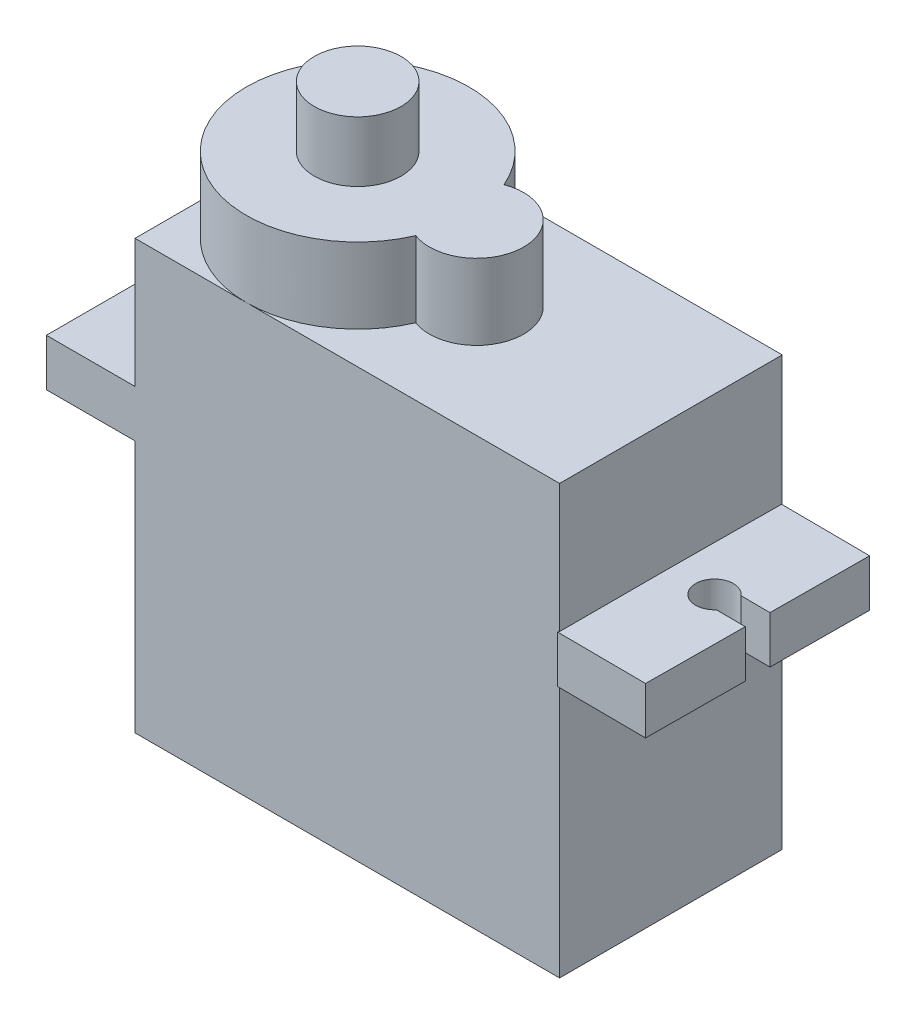
ISO-10303-21;
HEADER;
FILE_DESCRIPTION(('STEP AP214'),'2;1');
FILE_NAME('part.step','',(''),(''),'','','');
FILE_SCHEMA(('AUTOMOTIVE_DESIGN { 1 0 10303 214 1 1 1 1 }'));
ENDSEC;
DATA;
#1=APPLICATION_CONTEXT('core data for automotive mechanical design processes');
#2=APPLICATION_PROTOCOL_DEFINITION('international standard','automotive_design',2000,#1);
#3=PRODUCT_CONTEXT('',#1,'mechanical');
#4=PRODUCT('Part','Part','',(#3));
#5=PRODUCT_RELATED_PRODUCT_CATEGORY('part','',(#4));
#6=PRODUCT_DEFINITION_FORMATION('','',#4);
#7=PRODUCT_DEFINITION_CONTEXT('part definition',#1,'design');
#8=PRODUCT_DEFINITION('design','',#6,#7);
#9=PRODUCT_DEFINITION_SHAPE('','',#8);
#10=(LENGTH_UNIT() NAMED_UNIT(*) SI_UNIT(.MILLI.,.METRE.));
#11=(NAMED_UNIT(*) PLANE_ANGLE_UNIT() SI_UNIT($,.RADIAN.));
#12=(NAMED_UNIT(*) SI_UNIT($,.STERADIAN.) SOLID_ANGLE_UNIT());
#13=UNCERTAINTY_MEASURE_WITH_UNIT(LENGTH_MEASURE(1.E-05),#10,'distance_accuracy_value','');
#14=(GEOMETRIC_REPRESENTATION_CONTEXT(3) GLOBAL_UNCERTAINTY_ASSIGNED_CONTEXT((#13)) GLOBAL_UNIT_ASSIGNED_CONTEXT((#10,
#11,#12)) REPRESENTATION_CONTEXT('',''));
#15=CARTESIAN_POINT('',(0.,0.,0.));
#16=DIRECTION('',(0.,0.,1.));
#17=DIRECTION('',(1.,0.,0.));
#18=AXIS2_PLACEMENT_3D('',#15,#16,#17);
#19=CARTESIAN_POINT('',(-11.25,22.7,5.9));
#20=DIRECTION('',(1.,0.,0.));
#21=DIRECTION('',(0.,0.,-1.));
#22=AXIS2_PLACEMENT_3D('',#19,#20,#21);
#23=PLANE('',#22);
#24=DIRECTION('',(0.,0.,1.));
#25=VECTOR('',#24,1.);
#26=CARTESIAN_POINT('',(-11.25,13.4,-5.9));
#27=LINE('',#26,#25);
#28=CARTESIAN_POINT('',(-11.25,13.4,-5.9));
#29=VERTEX_POINT('',#28);
#30=CARTESIAN_POINT('',(-11.25,13.4,5.9));
#31=VERTEX_POINT('',#30);
#32=EDGE_CURVE('E274',#29,#31,#27,.T.);
#33=ORIENTED_EDGE('',*,*,#32,.F.);
#34=DIRECTION('',(0.,-1.,0.));
#35=VECTOR('',#34,1.);
#36=CARTESIAN_POINT('',(-11.25,22.7,-5.9));
#37=LINE('',#36,#35);
#38=CARTESIAN_POINT('',(-11.25,0.,-5.9));
#39=VERTEX_POINT('',#38);
#40=EDGE_CURVE('E384',#29,#39,#37,.T.);
#41=ORIENTED_EDGE('',*,*,#40,.T.);
#42=DIRECTION('',(0.,0.,1.));
#43=VECTOR('',#42,1.);
#44=CARTESIAN_POINT('',(-11.25,0.,5.9));
#45=LINE('',#44,#43);
#46=CARTESIAN_POINT('',(-11.25,0.,5.9));
#47=VERTEX_POINT('',#46);
#48=EDGE_CURVE('E373',#39,#47,#45,.T.);
#49=ORIENTED_EDGE('',*,*,#48,.T.);
#50=DIRECTION('',(0.,-1.,0.));
#51=VECTOR('',#50,1.);
#52=CARTESIAN_POINT('',(-11.25,22.7,5.9));
#53=LINE('',#52,#51);
#54=EDGE_CURVE('E380',#31,#47,#53,.T.);
#55=ORIENTED_EDGE('',*,*,#54,.F.);
#56=EDGE_LOOP('',(#33,#41,#49,#55));
#57=FACE_BOUND('',#56,.T.);
#58=ADVANCED_FACE('F32',(#57),#23,.F.);
#59=CARTESIAN_POINT('',(0.,22.7,0.));
#60=DIRECTION('',(0.,-1.,0.));
#61=DIRECTION('',(0.,0.,-1.));
#62=AXIS2_PLACEMENT_3D('',#59,#60,#61);
#63=PLANE('',#62);
#64=CARTESIAN_POINT('',(-5.35,22.7,0.));
#65=DIRECTION('',(0.,1.,0.));
#66=DIRECTION('',(0.,0.,1.));
#67=AXIS2_PLACEMENT_3D('',#64,#65,#66);
#68=CIRCLE('',#67,5.9);
#69=CARTESIAN_POINT('',(0.0666666666666715,22.7,-2.33874372735069));
#70=VERTEX_POINT('',#69);
#71=CARTESIAN_POINT('',(-5.35,22.7,-5.9));
#72=VERTEX_POINT('',#71);
#73=EDGE_CURVE('E328',#70,#72,#68,.T.);
#74=ORIENTED_EDGE('',*,*,#73,.F.);
#75=CARTESIAN_POINT('',(0.950000000000004,22.7,0.));
#76=DIRECTION('',(0.,1.,0.));
#77=DIRECTION('',(0.,0.,1.));
#78=AXIS2_PLACEMENT_3D('',#75,#76,#77);
#79=CIRCLE('',#78,2.5);
#80=CARTESIAN_POINT('',(0.0666666666666706,22.7,2.3387437273507));
#81=VERTEX_POINT('',#80);
#82=EDGE_CURVE('E333',#81,#70,#79,.T.);
#83=ORIENTED_EDGE('',*,*,#82,.F.);
#84=CARTESIAN_POINT('',(-5.35,22.7,5.9));
#85=VERTEX_POINT('',#84);
#86=EDGE_CURVE('E342',#85,#81,#68,.T.);
#87=ORIENTED_EDGE('',*,*,#86,.F.);
#88=DIRECTION('',(1.,0.,0.));
#89=VECTOR('',#88,1.);
#90=CARTESIAN_POINT('',(-11.25,22.7,5.9));
#91=LINE('',#90,#89);
#92=CARTESIAN_POINT('',(11.25,22.7,5.9));
#93=VERTEX_POINT('',#92);
#94=EDGE_CURVE('E363',#85,#93,#91,.T.);
#95=ORIENTED_EDGE('',*,*,#94,.T.);
#96=DIRECTION('',(0.,0.,-1.));
#97=VECTOR('',#96,1.);
#98=CARTESIAN_POINT('',(11.25,22.7,5.9));
#99=LINE('',#98,#97);
#100=CARTESIAN_POINT('',(11.25,22.7,-5.9));
#101=VERTEX_POINT('',#100);
#102=EDGE_CURVE('E351',#93,#101,#99,.T.);
#103=ORIENTED_EDGE('',*,*,#102,.T.);
#104=DIRECTION('',(-1.,0.,0.));
#105=VECTOR('',#104,1.);
#106=CARTESIAN_POINT('',(-11.25,22.7,-5.9));
#107=LINE('',#106,#105);
#108=EDGE_CURVE('E356',#101,#72,#107,.T.);
#109=ORIENTED_EDGE('',*,*,#108,.T.);
#110=EDGE_LOOP('',(#74,#83,#87,#95,#103,#109));
#111=FACE_BOUND('',#110,.T.);
#112=ADVANCED_FACE('F453',(#111),#63,.F.);
#113=CARTESIAN_POINT('',(-11.25,22.7,0.));
#114=VERTEX_POINT('',#113);
#115=EDGE_CURVE('E341',#72,#114,#68,.T.);
#116=ORIENTED_EDGE('',*,*,#115,.F.);
#117=CARTESIAN_POINT('',(-11.25,22.7,-5.9));
#118=VERTEX_POINT('',#117);
#119=EDGE_CURVE('E354',#72,#118,#107,.T.);
#120=ORIENTED_EDGE('',*,*,#119,.T.);
#121=DIRECTION('',(0.,0.,1.));
#122=VECTOR('',#121,1.);
#123=CARTESIAN_POINT('',(-11.25,22.7,5.9));
#124=LINE('',#123,#122);
#125=EDGE_CURVE('E360',#118,#114,#124,.T.);
#126=ORIENTED_EDGE('',*,*,#125,.T.);
#127=EDGE_LOOP('',(#116,#120,#126));
#128=FACE_BOUND('',#127,.T.);
#129=ADVANCED_FACE('F468',(#128),#63,.F.);
#130=CARTESIAN_POINT('',(11.25,22.7,5.9));
#131=DIRECTION('',(-1.,0.,0.));
#132=DIRECTION('',(0.,0.,1.));
#133=AXIS2_PLACEMENT_3D('',#130,#131,#132);
#134=PLANE('',#133);
#135=DIRECTION('',(0.,-1.,0.));
#136=VECTOR('',#135,1.);
#137=CARTESIAN_POINT('',(11.25,22.7,0.037071335455126));
#138=LINE('',#137,#136);
#139=CARTESIAN_POINT('',(11.25,15.9,0.0370713354447419));
#140=VERTEX_POINT('',#139);
#141=CARTESIAN_POINT('',(11.25,13.4,0.037071335455126));
#142=VERTEX_POINT('',#141);
#143=EDGE_CURVE('E47',#140,#142,#138,.T.);
#144=ORIENTED_EDGE('',*,*,#143,.T.);
#145=DIRECTION('',(0.,0.,1.));
#146=VECTOR('',#145,1.);
#147=CARTESIAN_POINT('',(11.25,13.4,5.9));
#148=LINE('',#147,#146);
#149=CARTESIAN_POINT('',(11.25,13.4,5.9));
#150=VERTEX_POINT('',#149);
#151=EDGE_CURVE('E270',#142,#150,#148,.T.);
#152=ORIENTED_EDGE('',*,*,#151,.T.);
#153=DIRECTION('',(0.,-1.,0.));
#154=VECTOR('',#153,1.);
#155=CARTESIAN_POINT('',(11.25,22.7,5.9));
#156=LINE('',#155,#154);
#157=CARTESIAN_POINT('',(11.25,0.,5.9));
#158=VERTEX_POINT('',#157);
#159=EDGE_CURVE('E367',#150,#158,#156,.T.);
#160=ORIENTED_EDGE('',*,*,#159,.T.);
#161=DIRECTION('',(0.,0.,-1.));
#162=VECTOR('',#161,1.);
#163=CARTESIAN_POINT('',(11.25,0.,5.9));
#164=LINE('',#163,#162);
#165=CARTESIAN_POINT('',(11.25,0.,-5.9));
#166=VERTEX_POINT('',#165);
#167=EDGE_CURVE('E350',#158,#166,#164,.T.);
#168=ORIENTED_EDGE('',*,*,#167,.T.);
#169=DIRECTION('',(0.,-1.,0.));
#170=VECTOR('',#169,1.);
#171=CARTESIAN_POINT('',(11.25,22.7,-5.9));
#172=LINE('',#171,#170);
#173=EDGE_CURVE('E388',#101,#166,#172,.T.);
#174=ORIENTED_EDGE('',*,*,#173,.F.);
#175=ORIENTED_EDGE('',*,*,#102,.F.);
#176=CARTESIAN_POINT('',(11.25,15.9,5.9));
#177=VERTEX_POINT('',#176);
#178=EDGE_CURVE('E378',#93,#177,#156,.T.);
#179=ORIENTED_EDGE('',*,*,#178,.T.);
#180=DIRECTION('',(0.,0.,1.));
#181=VECTOR('',#180,1.);
#182=CARTESIAN_POINT('',(11.25,15.9,5.9));
#183=LINE('',#182,#181);
#184=EDGE_CURVE('E52',#140,#177,#183,.T.);
#185=ORIENTED_EDGE('',*,*,#184,.F.);
#186=EDGE_LOOP('',(#144,#152,#160,#168,#174,#175,#179,#185));
#187=FACE_BOUND('',#186,.T.);
#188=ADVANCED_FACE('F34',(#187),#134,.F.);
#189=CARTESIAN_POINT('',(-11.25,22.7,-5.9));
#190=DIRECTION('',(0.,0.,1.));
#191=DIRECTION('',(1.,0.,0.));
#192=AXIS2_PLACEMENT_3D('',#189,#190,#191);
#193=PLANE('',#192);
#194=DIRECTION('',(-1.,0.,0.));
#195=VECTOR('',#194,1.);
#196=CARTESIAN_POINT('',(-11.25,0.,-5.9));
#197=LINE('',#196,#195);
#198=EDGE_CURVE('E370',#166,#39,#197,.T.);
#199=ORIENTED_EDGE('',*,*,#198,.T.);
#200=ORIENTED_EDGE('',*,*,#40,.F.);
#201=DIRECTION('',(1.,0.,0.));
#202=VECTOR('',#201,1.);
#203=CARTESIAN_POINT('',(-15.95,13.4,-5.9));
#204=LINE('',#203,#202);
#205=CARTESIAN_POINT('',(-15.95,13.4,-5.9));
#206=VERTEX_POINT('',#205);
#207=EDGE_CURVE('E290',#206,#29,#204,.T.);
#208=ORIENTED_EDGE('',*,*,#207,.F.);
#209=DIRECTION('',(0.,1.,0.));
#210=VECTOR('',#209,1.);
#211=CARTESIAN_POINT('',(-15.95,13.4,-5.9));
#212=LINE('',#211,#210);
#213=CARTESIAN_POINT('',(-15.95,15.9,-5.9));
#214=VERTEX_POINT('',#213);
#215=EDGE_CURVE('E292',#206,#214,#212,.T.);
#216=ORIENTED_EDGE('',*,*,#215,.T.);
#217=DIRECTION('',(1.,0.,0.));
#218=VECTOR('',#217,1.);
#219=CARTESIAN_POINT('',(-15.95,15.9,-5.9));
#220=LINE('',#219,#218);
#221=CARTESIAN_POINT('',(-11.25,15.9,-5.9));
#222=VERTEX_POINT('',#221);
#223=EDGE_CURVE('E277',#214,#222,#220,.T.);
#224=ORIENTED_EDGE('',*,*,#223,.T.);
#225=EDGE_CURVE('E385',#118,#222,#37,.T.);
#226=ORIENTED_EDGE('',*,*,#225,.F.);
#227=ORIENTED_EDGE('',*,*,#119,.F.);
#228=ORIENTED_EDGE('',*,*,#108,.F.);
#229=ORIENTED_EDGE('',*,*,#173,.T.);
#230=EDGE_LOOP('',(#199,#200,#208,#216,#224,#226,#227,#228,#229));
#231=FACE_BOUND('',#230,.T.);
#232=ADVANCED_FACE('F448',(#231),#193,.F.);
#233=ORIENTED_EDGE('',*,*,#225,.T.);
#234=DIRECTION('',(0.,0.,1.));
#235=VECTOR('',#234,1.);
#236=CARTESIAN_POINT('',(-11.25,15.9,-5.9));
#237=LINE('',#236,#235);
#238=CARTESIAN_POINT('',(-11.25,15.9,5.9));
#239=VERTEX_POINT('',#238);
#240=EDGE_CURVE('E273',#222,#239,#237,.T.);
#241=ORIENTED_EDGE('',*,*,#240,.T.);
#242=CARTESIAN_POINT('',(-11.25,22.7,5.9));
#243=VERTEX_POINT('',#242);
#244=EDGE_CURVE('E381',#243,#239,#53,.T.);
#245=ORIENTED_EDGE('',*,*,#244,.F.);
#246=EDGE_CURVE('E359',#114,#243,#124,.T.);
#247=ORIENTED_EDGE('',*,*,#246,.F.);
#248=ORIENTED_EDGE('',*,*,#125,.F.);
#249=EDGE_LOOP('',(#233,#241,#245,#247,#248));
#250=FACE_BOUND('',#249,.T.);
#251=ADVANCED_FACE('F471',(#250),#23,.F.);
#252=CARTESIAN_POINT('',(-11.25,22.7,5.9));
#253=DIRECTION('',(0.,0.,-1.));
#254=DIRECTION('',(-1.,0.,0.));
#255=AXIS2_PLACEMENT_3D('',#252,#253,#254);
#256=PLANE('',#255);
#257=ORIENTED_EDGE('',*,*,#159,.F.);
#258=DIRECTION('',(-1.,0.,0.));
#259=VECTOR('',#258,1.);
#260=CARTESIAN_POINT('',(-11.25,13.4,5.9));
#261=LINE('',#260,#259);
#262=CARTESIAN_POINT('',(11.2113601857123,13.4,5.9));
#263=VERTEX_POINT('',#262);
#264=EDGE_CURVE('E11',#150,#263,#261,.T.);
#265=ORIENTED_EDGE('',*,*,#264,.T.);
#266=DIRECTION('',(0.,1.,0.));
#267=VECTOR('',#266,1.);
#268=CARTESIAN_POINT('',(11.2113601857123,22.7,5.9));
#269=LINE('',#268,#267);
#270=CARTESIAN_POINT('',(11.2113601857123,15.9,5.9));
#271=VERTEX_POINT('',#270);
#272=EDGE_CURVE('E40',#263,#271,#269,.T.);
#273=ORIENTED_EDGE('',*,*,#272,.T.);
#274=DIRECTION('',(-1.,0.,0.));
#275=VECTOR('',#274,1.);
#276=CARTESIAN_POINT('',(-11.25,15.9,5.9));
#277=LINE('',#276,#275);
#278=EDGE_CURVE('E391',#177,#271,#277,.T.);
#279=ORIENTED_EDGE('',*,*,#278,.F.);
#280=ORIENTED_EDGE('',*,*,#178,.F.);
#281=ORIENTED_EDGE('',*,*,#94,.F.);
#282=EDGE_CURVE('E364',#243,#85,#91,.T.);
#283=ORIENTED_EDGE('',*,*,#282,.F.);
#284=ORIENTED_EDGE('',*,*,#244,.T.);
#285=DIRECTION('',(-1.,0.,0.));
#286=VECTOR('',#285,1.);
#287=CARTESIAN_POINT('',(-11.25,15.9,5.9));
#288=LINE('',#287,#286);
#289=CARTESIAN_POINT('',(-15.95,15.9,5.9));
#290=VERTEX_POINT('',#289);
#291=EDGE_CURVE('E295',#239,#290,#288,.T.);
#292=ORIENTED_EDGE('',*,*,#291,.T.);
#293=DIRECTION('',(0.,1.,0.));
#294=VECTOR('',#293,1.);
#295=CARTESIAN_POINT('',(-15.95,13.4,5.9));
#296=LINE('',#295,#294);
#297=CARTESIAN_POINT('',(-15.95,13.4,5.9));
#298=VERTEX_POINT('',#297);
#299=EDGE_CURVE('E322',#298,#290,#296,.T.);
#300=ORIENTED_EDGE('',*,*,#299,.F.);
#301=DIRECTION('',(-1.,0.,0.));
#302=VECTOR('',#301,1.);
#303=CARTESIAN_POINT('',(-11.25,13.4,5.9));
#304=LINE('',#303,#302);
#305=EDGE_CURVE('E276',#31,#298,#304,.T.);
#306=ORIENTED_EDGE('',*,*,#305,.F.);
#307=ORIENTED_EDGE('',*,*,#54,.T.);
#308=DIRECTION('',(1.,0.,0.));
#309=VECTOR('',#308,1.);
#310=CARTESIAN_POINT('',(-11.25,0.,5.9));
#311=LINE('',#310,#309);
#312=EDGE_CURVE('E355',#47,#158,#311,.T.);
#313=ORIENTED_EDGE('',*,*,#312,.T.);
#314=EDGE_LOOP('',(#257,#265,#273,#279,#280,#281,#283,#284,#292,#300,#306,#307,#313));
#315=FACE_BOUND('',#314,.T.);
#316=ADVANCED_FACE('F396',(#315),#256,.F.);
#317=EDGE_CURVE('E460',#114,#85,#68,.T.);
#318=ORIENTED_EDGE('',*,*,#317,.F.);
#319=ORIENTED_EDGE('',*,*,#246,.T.);
#320=ORIENTED_EDGE('',*,*,#282,.T.);
#321=EDGE_LOOP('',(#318,#319,#320));
#322=FACE_BOUND('',#321,.T.);
#323=ADVANCED_FACE('F459',(#322),#63,.F.);
#324=CARTESIAN_POINT('',(0.,0.,0.));
#325=DIRECTION('',(0.,-1.,0.));
#326=DIRECTION('',(0.,0.,-1.));
#327=AXIS2_PLACEMENT_3D('',#324,#325,#326);
#328=PLANE('',#327);
#329=ORIENTED_EDGE('',*,*,#167,.F.);
#330=ORIENTED_EDGE('',*,*,#312,.F.);
#331=ORIENTED_EDGE('',*,*,#48,.F.);
#332=ORIENTED_EDGE('',*,*,#198,.F.);
#333=EDGE_LOOP('',(#329,#330,#331,#332));
#334=FACE_BOUND('',#333,.T.);
#335=ADVANCED_FACE('F444',(#334),#328,.T.);
#336=CARTESIAN_POINT('',(-5.35,26.7,0.));
#337=DIRECTION('',(0.,-1.,0.));
#338=DIRECTION('',(0.,0.,-1.));
#339=AXIS2_PLACEMENT_3D('',#336,#337,#338);
#340=CYLINDRICAL_SURFACE('',#339,5.9);
#341=ORIENTED_EDGE('',*,*,#73,.T.);
#342=ORIENTED_EDGE('',*,*,#115,.T.);
#343=ORIENTED_EDGE('',*,*,#317,.T.);
#344=ORIENTED_EDGE('',*,*,#86,.T.);
#345=DIRECTION('',(0.,-1.,0.));
#346=VECTOR('',#345,1.);
#347=CARTESIAN_POINT('',(0.0666666666666706,26.7,2.3387437273507));
#348=LINE('',#347,#346);
#349=CARTESIAN_POINT('',(0.0666666666666706,26.7,2.3387437273507));
#350=VERTEX_POINT('',#349);
#351=EDGE_CURVE('E347',#350,#81,#348,.T.);
#352=ORIENTED_EDGE('',*,*,#351,.F.);
#353=CARTESIAN_POINT('',(-5.35,26.7,0.));
#354=DIRECTION('',(0.,1.,0.));
#355=DIRECTION('',(0.,0.,1.));
#356=AXIS2_PLACEMENT_3D('',#353,#354,#355);
#357=CIRCLE('',#356,5.9);
#358=CARTESIAN_POINT('',(0.0666666666666715,26.7,-2.33874372735069));
#359=VERTEX_POINT('',#358);
#360=EDGE_CURVE('E332',#359,#350,#357,.T.);
#361=ORIENTED_EDGE('',*,*,#360,.F.);
#362=DIRECTION('',(0.,-1.,0.));
#363=VECTOR('',#362,1.);
#364=CARTESIAN_POINT('',(0.0666666666666715,26.7,-2.33874372735069));
#365=LINE('',#364,#363);
#366=EDGE_CURVE('E338',#359,#70,#365,.T.);
#367=ORIENTED_EDGE('',*,*,#366,.T.);
#368=EDGE_LOOP('',(#341,#342,#343,#344,#352,#361,#367));
#369=FACE_BOUND('',#368,.T.);
#370=ADVANCED_FACE('F465',(#369),#340,.T.);
#371=CARTESIAN_POINT('',(0.950000000000004,26.7,0.));
#372=DIRECTION('',(0.,-1.,0.));
#373=DIRECTION('',(0.,0.,-1.));
#374=AXIS2_PLACEMENT_3D('',#371,#372,#373);
#375=CYLINDRICAL_SURFACE('',#374,2.5);
#376=ORIENTED_EDGE('',*,*,#82,.T.);
#377=ORIENTED_EDGE('',*,*,#366,.F.);
#378=CARTESIAN_POINT('',(0.950000000000004,26.7,0.));
#379=DIRECTION('',(0.,1.,0.));
#380=DIRECTION('',(0.,0.,1.));
#381=AXIS2_PLACEMENT_3D('',#378,#379,#380);
#382=CIRCLE('',#381,2.5);
#383=EDGE_CURVE('E336',#350,#359,#382,.T.);
#384=ORIENTED_EDGE('',*,*,#383,.F.);
#385=ORIENTED_EDGE('',*,*,#351,.T.);
#386=EDGE_LOOP('',(#376,#377,#384,#385));
#387=FACE_BOUND('',#386,.T.);
#388=ADVANCED_FACE('F543',(#387),#375,.T.);
#389=CARTESIAN_POINT('',(0.,26.7,0.));
#390=DIRECTION('',(0.,1.,0.));
#391=DIRECTION('',(0.,0.,1.));
#392=AXIS2_PLACEMENT_3D('',#389,#390,#391);
#393=PLANE('',#392);
#394=CARTESIAN_POINT('',(-5.35,26.7,0.));
#395=DIRECTION('',(0.,1.,0.));
#396=DIRECTION('',(0.,0.,1.));
#397=AXIS2_PLACEMENT_3D('',#394,#395,#396);
#398=CIRCLE('',#397,2.3);
#399=CARTESIAN_POINT('',(-5.35,26.7,2.3));
#400=VERTEX_POINT('',#399);
#401=EDGE_CURVE('E329',#400,#400,#398,.T.);
#402=ORIENTED_EDGE('',*,*,#401,.F.);
#403=EDGE_LOOP('',(#402));
#404=FACE_BOUND('',#403,.T.);
#405=ORIENTED_EDGE('',*,*,#360,.T.);
#406=ORIENTED_EDGE('',*,*,#383,.T.);
#407=EDGE_LOOP('',(#405,#406));
#408=FACE_BOUND('',#407,.T.);
#409=ADVANCED_FACE('F547',(#404,#408),#393,.T.);
#410=CARTESIAN_POINT('',(-5.35,29.9,0.));
#411=DIRECTION('',(0.,-1.,0.));
#412=DIRECTION('',(0.,0.,-1.));
#413=AXIS2_PLACEMENT_3D('',#410,#411,#412);
#414=CYLINDRICAL_SURFACE('',#413,2.3);
#415=ORIENTED_EDGE('',*,*,#401,.T.);
#416=EDGE_LOOP('',(#415));
#417=FACE_BOUND('',#416,.T.);
#418=CARTESIAN_POINT('',(-5.35,29.9,0.));
#419=DIRECTION('',(0.,1.,0.));
#420=DIRECTION('',(0.,0.,1.));
#421=AXIS2_PLACEMENT_3D('',#418,#419,#420);
#422=CIRCLE('',#421,2.3);
#423=CARTESIAN_POINT('',(-5.35,29.9,2.3));
#424=VERTEX_POINT('',#423);
#425=EDGE_CURVE('E325',#424,#424,#422,.T.);
#426=ORIENTED_EDGE('',*,*,#425,.F.);
#427=EDGE_LOOP('',(#426));
#428=FACE_BOUND('',#427,.T.);
#429=ADVANCED_FACE('F553',(#417,#428),#414,.T.);
#430=CARTESIAN_POINT('',(-5.35,29.9,0.));
#431=DIRECTION('',(0.,1.,0.));
#432=DIRECTION('',(0.,0.,1.));
#433=AXIS2_PLACEMENT_3D('',#430,#431,#432);
#434=PLANE('',#433);
#435=ORIENTED_EDGE('',*,*,#425,.T.);
#436=EDGE_LOOP('',(#435));
#437=FACE_BOUND('',#436,.T.);
#438=ADVANCED_FACE('F557',(#437),#434,.T.);
#439=CARTESIAN_POINT('',(-15.95,13.4,5.9));
#440=DIRECTION('',(1.,0.,0.));
#441=DIRECTION('',(0.,0.,-1.));
#442=AXIS2_PLACEMENT_3D('',#439,#440,#441);
#443=PLANE('',#442);
#444=DIRECTION('',(0.,0.,-1.));
#445=VECTOR('',#444,1.);
#446=CARTESIAN_POINT('',(-15.95,15.9,5.9));
#447=LINE('',#446,#445);
#448=CARTESIAN_POINT('',(-15.95,15.9,0.65));
#449=VERTEX_POINT('',#448);
#450=EDGE_CURVE('E297',#290,#449,#447,.T.);
#451=ORIENTED_EDGE('',*,*,#450,.T.);
#452=DIRECTION('',(0.,1.,0.));
#453=VECTOR('',#452,1.);
#454=CARTESIAN_POINT('',(-15.95,13.4,0.65));
#455=LINE('',#454,#453);
#456=CARTESIAN_POINT('',(-15.95,13.4,0.65));
#457=VERTEX_POINT('',#456);
#458=EDGE_CURVE('E320',#457,#449,#455,.T.);
#459=ORIENTED_EDGE('',*,*,#458,.F.);
#460=DIRECTION('',(0.,0.,-1.));
#461=VECTOR('',#460,1.);
#462=CARTESIAN_POINT('',(-15.95,13.4,5.9));
#463=LINE('',#462,#461);
#464=EDGE_CURVE('E279',#298,#457,#463,.T.);
#465=ORIENTED_EDGE('',*,*,#464,.F.);
#466=ORIENTED_EDGE('',*,*,#299,.T.);
#467=EDGE_LOOP('',(#451,#459,#465,#466));
#468=FACE_BOUND('',#467,.T.);
#469=ADVANCED_FACE('F478',(#468),#443,.F.);
#470=CARTESIAN_POINT('',(-14.4099342076785,13.4,0.65));
#471=DIRECTION('',(0.,0.,-1.));
#472=DIRECTION('',(-1.,0.,0.));
#473=AXIS2_PLACEMENT_3D('',#470,#471,#472);
#474=PLANE('',#473);
#475=DIRECTION('',(-1.,0.,0.));
#476=VECTOR('',#475,1.);
#477=CARTESIAN_POINT('',(-14.4099342076785,15.9,0.65));
#478=LINE('',#477,#476);
#479=CARTESIAN_POINT('',(-14.4099342076785,15.9,0.65));
#480=VERTEX_POINT('',#479);
#481=EDGE_CURVE('E300',#480,#449,#478,.T.);
#482=ORIENTED_EDGE('',*,*,#481,.F.);
#483=DIRECTION('',(0.,1.,0.));
#484=VECTOR('',#483,1.);
#485=CARTESIAN_POINT('',(-14.4099342076785,13.4,0.65));
#486=LINE('',#485,#484);
#487=CARTESIAN_POINT('',(-14.4099342076785,13.4,0.65));
#488=VERTEX_POINT('',#487);
#489=EDGE_CURVE('E318',#488,#480,#486,.T.);
#490=ORIENTED_EDGE('',*,*,#489,.F.);
#491=DIRECTION('',(-1.,0.,0.));
#492=VECTOR('',#491,1.);
#493=CARTESIAN_POINT('',(-14.4099342076785,13.4,0.65));
#494=LINE('',#493,#492);
#495=EDGE_CURVE('E281',#488,#457,#494,.T.);
#496=ORIENTED_EDGE('',*,*,#495,.T.);
#497=ORIENTED_EDGE('',*,*,#458,.T.);
#498=EDGE_LOOP('',(#482,#490,#496,#497));
#499=FACE_BOUND('',#498,.T.);
#500=ADVANCED_FACE('F485',(#499),#474,.T.);
#501=CARTESIAN_POINT('',(-13.65,13.4,0.));
#502=DIRECTION('',(0.,1.,0.));
#503=DIRECTION('',(0.,0.,1.));
#504=AXIS2_PLACEMENT_3D('',#501,#502,#503);
#505=CYLINDRICAL_SURFACE('',#504,1.);
#506=CARTESIAN_POINT('',(-13.65,15.9,0.));
#507=DIRECTION('',(0.,1.,0.));
#508=DIRECTION('',(0.,0.,1.));
#509=AXIS2_PLACEMENT_3D('',#506,#507,#508);
#510=CIRCLE('',#509,1.);
#511=CARTESIAN_POINT('',(-14.4099342076785,15.9,-0.65));
#512=VERTEX_POINT('',#511);
#513=EDGE_CURVE('E303',#480,#512,#510,.T.);
#514=ORIENTED_EDGE('',*,*,#513,.T.);
#515=DIRECTION('',(0.,1.,0.));
#516=VECTOR('',#515,1.);
#517=CARTESIAN_POINT('',(-14.4099342076785,13.4,-0.65));
#518=LINE('',#517,#516);
#519=CARTESIAN_POINT('',(-14.4099342076785,13.4,-0.65));
#520=VERTEX_POINT('',#519);
#521=EDGE_CURVE('E315',#520,#512,#518,.T.);
#522=ORIENTED_EDGE('',*,*,#521,.F.);
#523=CARTESIAN_POINT('',(-13.65,13.4,0.));
#524=DIRECTION('',(0.,1.,0.));
#525=DIRECTION('',(0.,0.,1.));
#526=AXIS2_PLACEMENT_3D('',#523,#524,#525);
#527=CIRCLE('',#526,1.);
#528=EDGE_CURVE('E284',#488,#520,#527,.T.);
#529=ORIENTED_EDGE('',*,*,#528,.F.);
#530=ORIENTED_EDGE('',*,*,#489,.T.);
#531=EDGE_LOOP('',(#514,#522,#529,#530));
#532=FACE_BOUND('',#531,.T.);
#533=ADVANCED_FACE('F505',(#532),#505,.F.);
#534=CARTESIAN_POINT('',(-14.4099342076785,13.4,-0.65));
#535=DIRECTION('',(0.,0.,-1.));
#536=DIRECTION('',(-1.,0.,0.));
#537=AXIS2_PLACEMENT_3D('',#534,#535,#536);
#538=PLANE('',#537);
#539=DIRECTION('',(-1.,0.,0.));
#540=VECTOR('',#539,1.);
#541=CARTESIAN_POINT('',(-14.4099342076785,15.9,-0.65));
#542=LINE('',#541,#540);
#543=CARTESIAN_POINT('',(-15.95,15.9,-0.65));
#544=VERTEX_POINT('',#543);
#545=EDGE_CURVE('E305',#512,#544,#542,.T.);
#546=ORIENTED_EDGE('',*,*,#545,.T.);
#547=DIRECTION('',(0.,1.,0.));
#548=VECTOR('',#547,1.);
#549=CARTESIAN_POINT('',(-15.95,13.4,-0.65));
#550=LINE('',#549,#548);
#551=CARTESIAN_POINT('',(-15.95,13.4,-0.65));
#552=VERTEX_POINT('',#551);
#553=EDGE_CURVE('E312',#552,#544,#550,.T.);
#554=ORIENTED_EDGE('',*,*,#553,.F.);
#555=DIRECTION('',(-1.,0.,0.));
#556=VECTOR('',#555,1.);
#557=CARTESIAN_POINT('',(-14.4099342076785,13.4,-0.65));
#558=LINE('',#557,#556);
#559=EDGE_CURVE('E286',#520,#552,#558,.T.);
#560=ORIENTED_EDGE('',*,*,#559,.F.);
#561=ORIENTED_EDGE('',*,*,#521,.T.);
#562=EDGE_LOOP('',(#546,#554,#560,#561));
#563=FACE_BOUND('',#562,.T.);
#564=ADVANCED_FACE('F503',(#563),#538,.F.);
#565=CARTESIAN_POINT('',(-15.95,13.4,-0.65));
#566=DIRECTION('',(1.,0.,0.));
#567=DIRECTION('',(0.,0.,-1.));
#568=AXIS2_PLACEMENT_3D('',#565,#566,#567);
#569=PLANE('',#568);
#570=DIRECTION('',(0.,0.,-1.));
#571=VECTOR('',#570,1.);
#572=CARTESIAN_POINT('',(-15.95,15.9,-0.65));
#573=LINE('',#572,#571);
#574=EDGE_CURVE('E307',#544,#214,#573,.T.);
#575=ORIENTED_EDGE('',*,*,#574,.T.);
#576=ORIENTED_EDGE('',*,*,#215,.F.);
#577=DIRECTION('',(0.,0.,-1.));
#578=VECTOR('',#577,1.);
#579=CARTESIAN_POINT('',(-15.95,13.4,-0.65));
#580=LINE('',#579,#578);
#581=EDGE_CURVE('E288',#552,#206,#580,.T.);
#582=ORIENTED_EDGE('',*,*,#581,.F.);
#583=ORIENTED_EDGE('',*,*,#553,.T.);
#584=EDGE_LOOP('',(#575,#576,#582,#583));
#585=FACE_BOUND('',#584,.T.);
#586=ADVANCED_FACE('F500',(#585),#569,.F.);
#587=CARTESIAN_POINT('',(-13.65,13.4,0.));
#588=DIRECTION('',(0.,1.,0.));
#589=DIRECTION('',(0.,0.,1.));
#590=AXIS2_PLACEMENT_3D('',#587,#588,#589);
#591=PLANE('',#590);
#592=ORIENTED_EDGE('',*,*,#32,.T.);
#593=ORIENTED_EDGE('',*,*,#305,.T.);
#594=ORIENTED_EDGE('',*,*,#464,.T.);
#595=ORIENTED_EDGE('',*,*,#495,.F.);
#596=ORIENTED_EDGE('',*,*,#528,.T.);
#597=ORIENTED_EDGE('',*,*,#559,.T.);
#598=ORIENTED_EDGE('',*,*,#581,.T.);
#599=ORIENTED_EDGE('',*,*,#207,.T.);
#600=EDGE_LOOP('',(#592,#593,#594,#595,#596,#597,#598,#599));
#601=FACE_BOUND('',#600,.T.);
#602=ADVANCED_FACE('F489',(#601),#591,.F.);
#603=CARTESIAN_POINT('',(-13.65,15.9,0.));
#604=DIRECTION('',(0.,1.,0.));
#605=DIRECTION('',(0.,0.,1.));
#606=AXIS2_PLACEMENT_3D('',#603,#604,#605);
#607=PLANE('',#606);
#608=ORIENTED_EDGE('',*,*,#240,.F.);
#609=ORIENTED_EDGE('',*,*,#223,.F.);
#610=ORIENTED_EDGE('',*,*,#574,.F.);
#611=ORIENTED_EDGE('',*,*,#545,.F.);
#612=ORIENTED_EDGE('',*,*,#513,.F.);
#613=ORIENTED_EDGE('',*,*,#481,.T.);
#614=ORIENTED_EDGE('',*,*,#450,.F.);
#615=ORIENTED_EDGE('',*,*,#291,.F.);
#616=EDGE_LOOP('',(#608,#609,#610,#611,#612,#613,#614,#615));
#617=FACE_BOUND('',#616,.T.);
#618=ADVANCED_FACE('F480',(#617),#607,.T.);
#619=CARTESIAN_POINT('',(11.2886389751529,13.4,-5.82573000478556));
#620=DIRECTION('',(-0.999978283156703,0.,-0.00659038807457617));
#621=DIRECTION('',(-0.00659038807457617,0.,0.999978283156703));
#622=AXIS2_PLACEMENT_3D('',#619,#620,#621);
#623=PLANE('',#622);
#624=ORIENTED_EDGE('',*,*,#143,.F.);
#625=DIRECTION('',(-0.00659038807457617,0.,0.999978283156703));
#626=VECTOR('',#625,1.);
#627=CARTESIAN_POINT('',(11.2886389751529,15.9,-5.82573000478556));
#628=LINE('',#627,#626);
#629=CARTESIAN_POINT('',(11.2886389751529,15.9,-5.82573000478556));
#630=VERTEX_POINT('',#629);
#631=EDGE_CURVE('E219',#630,#140,#628,.T.);
#632=ORIENTED_EDGE('',*,*,#631,.F.);
#633=DIRECTION('',(0.,1.,0.));
#634=VECTOR('',#633,1.);
#635=CARTESIAN_POINT('',(11.2886389751529,13.4,-5.82573000478556));
#636=LINE('',#635,#634);
#637=CARTESIAN_POINT('',(11.2886389751529,13.4,-5.82573000478556));
#638=VERTEX_POINT('',#637);
#639=EDGE_CURVE('E206',#638,#630,#636,.T.);
#640=ORIENTED_EDGE('',*,*,#639,.F.);
#641=DIRECTION('',(-0.00659038807457617,0.,0.999978283156703));
#642=VECTOR('',#641,1.);
#643=CARTESIAN_POINT('',(11.2886389751529,13.4,-5.82573000478556));
#644=LINE('',#643,#642);
#645=EDGE_CURVE('E229',#638,#142,#644,.T.);
#646=ORIENTED_EDGE('',*,*,#645,.T.);
#647=EDGE_LOOP('',(#624,#632,#640,#646));
#648=FACE_BOUND('',#647,.T.);
#649=ADVANCED_FACE('F220',(#648),#623,.T.);
#650=ORIENTED_EDGE('',*,*,#272,.F.);
#651=CARTESIAN_POINT('',(11.2108723958729,13.4,5.97401373646355));
#652=VERTEX_POINT('',#651);
#653=EDGE_CURVE('E233',#263,#652,#644,.T.);
#654=ORIENTED_EDGE('',*,*,#653,.T.);
#655=DIRECTION('',(0.,1.,0.));
#656=VECTOR('',#655,1.);
#657=CARTESIAN_POINT('',(11.2108723958729,13.4,5.97401373646355));
#658=LINE('',#657,#656);
#659=CARTESIAN_POINT('',(11.2108723958729,15.9,5.97401373646355));
#660=VERTEX_POINT('',#659);
#661=EDGE_CURVE('E252',#652,#660,#658,.T.);
#662=ORIENTED_EDGE('',*,*,#661,.T.);
#663=EDGE_CURVE('E222',#271,#660,#628,.T.);
#664=ORIENTED_EDGE('',*,*,#663,.F.);
#665=EDGE_LOOP('',(#650,#654,#662,#664));
#666=FACE_BOUND('',#665,.T.);
#667=ADVANCED_FACE('F403',(#666),#623,.T.);
#668=CARTESIAN_POINT('',(13.649703565089,13.4,0.0899587972179741));
#669=DIRECTION('',(0.,-1.,0.));
#670=DIRECTION('',(0.,0.,-1.));
#671=AXIS2_PLACEMENT_3D('',#668,#669,#670);
#672=PLANE('',#671);
#673=ORIENTED_EDGE('',*,*,#151,.F.);
#674=ORIENTED_EDGE('',*,*,#645,.F.);
#675=DIRECTION('',(-0.999978283156703,0.,-0.00659038807457693));
#676=VECTOR('',#675,1.);
#677=CARTESIAN_POINT('',(15.9885369059894,13.4,-5.79475518083505));
#678=LINE('',#677,#676);
#679=CARTESIAN_POINT('',(15.9885369059894,13.4,-5.79475518083505));
#680=VERTEX_POINT('',#679);
#681=EDGE_CURVE('E212',#680,#638,#678,.T.);
#682=ORIENTED_EDGE('',*,*,#681,.F.);
#683=DIRECTION('',(0.00659038807457588,0.,-0.999978283156703));
#684=VECTOR('',#683,1.);
#685=CARTESIAN_POINT('',(15.9539373685979,13.4,-0.544869194262361));
#686=LINE('',#685,#684);
#687=CARTESIAN_POINT('',(15.9539373685979,13.4,-0.544869194262361));
#688=VERTEX_POINT('',#687);
#689=EDGE_CURVE('E251',#688,#680,#686,.T.);
#690=ORIENTED_EDGE('',*,*,#689,.F.);
#691=DIRECTION('',(0.999978283156703,0.,0.00659038807457496));
#692=VECTOR('',#691,1.);
#693=CARTESIAN_POINT('',(14.4139050216439,13.4,-0.555018825494138));
#694=LINE('',#693,#692);
#695=CARTESIAN_POINT('',(14.4139050216439,13.4,-0.555018825494138));
#696=VERTEX_POINT('',#695);
#697=EDGE_CURVE('E255',#696,#688,#694,.T.);
#698=ORIENTED_EDGE('',*,*,#697,.F.);
#699=CARTESIAN_POINT('',(13.649703565089,13.4,0.0899587972179741));
#700=DIRECTION('',(0.,-1.,0.));
#701=DIRECTION('',(0.,0.,-1.));
#702=AXIS2_PLACEMENT_3D('',#699,#700,#701);
#703=CIRCLE('',#702,1.);
#704=CARTESIAN_POINT('',(14.4053375171469,13.4,0.744952942609583));
#705=VERTEX_POINT('',#704);
#706=EDGE_CURVE('E258',#705,#696,#703,.T.);
#707=ORIENTED_EDGE('',*,*,#706,.F.);
#708=DIRECTION('',(0.999978283156702,0.,0.00659038807457502));
#709=VECTOR('',#708,1.);
#710=CARTESIAN_POINT('',(14.4053375171469,13.4,0.744952942609583));
#711=LINE('',#710,#709);
#712=CARTESIAN_POINT('',(15.9453698641009,13.4,0.755102573841359));
#713=VERTEX_POINT('',#712);
#714=EDGE_CURVE('E261',#705,#713,#711,.T.);
#715=ORIENTED_EDGE('',*,*,#714,.T.);
#716=DIRECTION('',(0.0065903880745772,0.,-0.999978283156702));
#717=VECTOR('',#716,1.);
#718=CARTESIAN_POINT('',(15.9107703267094,13.4,6.00498856041405));
#719=LINE('',#718,#717);
#720=CARTESIAN_POINT('',(15.9107703267094,13.4,6.00498856041405));
#721=VERTEX_POINT('',#720);
#722=EDGE_CURVE('E263',#721,#713,#719,.T.);
#723=ORIENTED_EDGE('',*,*,#722,.F.);
#724=DIRECTION('',(0.999978283156703,0.,0.0065903880745749));
#725=VECTOR('',#724,1.);
#726=CARTESIAN_POINT('',(11.2108723958729,13.4,5.97401373646355));
#727=LINE('',#726,#725);
#728=EDGE_CURVE('E266',#652,#721,#727,.T.);
#729=ORIENTED_EDGE('',*,*,#728,.F.);
#730=ORIENTED_EDGE('',*,*,#653,.F.);
#731=ORIENTED_EDGE('',*,*,#264,.F.);
#732=EDGE_LOOP('',(#673,#674,#682,#690,#698,#707,#715,#723,#729,#730,#731));
#733=FACE_BOUND('',#732,.T.);
#734=ADVANCED_FACE('F437',(#733),#672,.T.);
#735=CARTESIAN_POINT('',(13.649703565089,15.9,0.0899587972179741));
#736=DIRECTION('',(0.,-1.,0.));
#737=DIRECTION('',(0.,0.,-1.));
#738=AXIS2_PLACEMENT_3D('',#735,#736,#737);
#739=PLANE('',#738);
#740=ORIENTED_EDGE('',*,*,#631,.T.);
#741=ORIENTED_EDGE('',*,*,#184,.T.);
#742=ORIENTED_EDGE('',*,*,#278,.T.);
#743=ORIENTED_EDGE('',*,*,#663,.T.);
#744=DIRECTION('',(0.999978283156703,0.,0.0065903880745749));
#745=VECTOR('',#744,1.);
#746=CARTESIAN_POINT('',(11.2108723958729,15.9,5.97401373646355));
#747=LINE('',#746,#745);
#748=CARTESIAN_POINT('',(15.9107703267094,15.9,6.00498856041405));
#749=VERTEX_POINT('',#748);
#750=EDGE_CURVE('E247',#660,#749,#747,.T.);
#751=ORIENTED_EDGE('',*,*,#750,.T.);
#752=DIRECTION('',(0.0065903880745772,0.,-0.999978283156702));
#753=VECTOR('',#752,1.);
#754=CARTESIAN_POINT('',(15.9107703267094,15.9,6.00498856041405));
#755=LINE('',#754,#753);
#756=CARTESIAN_POINT('',(15.9453698641009,15.9,0.755102573841359));
#757=VERTEX_POINT('',#756);
#758=EDGE_CURVE('E244',#749,#757,#755,.T.);
#759=ORIENTED_EDGE('',*,*,#758,.T.);
#760=DIRECTION('',(0.999978283156702,0.,0.00659038807457502));
#761=VECTOR('',#760,1.);
#762=CARTESIAN_POINT('',(14.4053375171469,15.9,0.744952942609583));
#763=LINE('',#762,#761);
#764=CARTESIAN_POINT('',(14.4053375171469,15.9,0.744952942609583));
#765=VERTEX_POINT('',#764);
#766=EDGE_CURVE('E241',#765,#757,#763,.T.);
#767=ORIENTED_EDGE('',*,*,#766,.F.);
#768=CARTESIAN_POINT('',(13.649703565089,15.9,0.0899587972179741));
#769=DIRECTION('',(0.,-1.,0.));
#770=DIRECTION('',(0.,0.,-1.));
#771=AXIS2_PLACEMENT_3D('',#768,#769,#770);
#772=CIRCLE('',#771,1.);
#773=CARTESIAN_POINT('',(14.4139050216439,15.9,-0.555018825494138));
#774=VERTEX_POINT('',#773);
#775=EDGE_CURVE('E238',#765,#774,#772,.T.);
#776=ORIENTED_EDGE('',*,*,#775,.T.);
#777=DIRECTION('',(0.999978283156703,0.,0.00659038807457496));
#778=VECTOR('',#777,1.);
#779=CARTESIAN_POINT('',(14.4139050216439,15.9,-0.555018825494138));
#780=LINE('',#779,#778);
#781=CARTESIAN_POINT('',(15.9539373685979,15.9,-0.544869194262361));
#782=VERTEX_POINT('',#781);
#783=EDGE_CURVE('E231',#774,#782,#780,.T.);
#784=ORIENTED_EDGE('',*,*,#783,.T.);
#785=DIRECTION('',(0.00659038807457588,0.,-0.999978283156703));
#786=VECTOR('',#785,1.);
#787=CARTESIAN_POINT('',(15.9539373685979,15.9,-0.544869194262361));
#788=LINE('',#787,#786);
#789=CARTESIAN_POINT('',(15.9885369059894,15.9,-5.79475518083505));
#790=VERTEX_POINT('',#789);
#791=EDGE_CURVE('E228',#782,#790,#788,.T.);
#792=ORIENTED_EDGE('',*,*,#791,.T.);
#793=DIRECTION('',(-0.999978283156703,0.,-0.00659038807457693));
#794=VECTOR('',#793,1.);
#795=CARTESIAN_POINT('',(15.9885369059894,15.9,-5.79475518083505));
#796=LINE('',#795,#794);
#797=EDGE_CURVE('E210',#790,#630,#796,.T.);
#798=ORIENTED_EDGE('',*,*,#797,.T.);
#799=EDGE_LOOP('',(#740,#741,#742,#743,#751,#759,#767,#776,#784,#792,#798));
#800=FACE_BOUND('',#799,.T.);
#801=ADVANCED_FACE('F225',(#800),#739,.F.);
#802=CARTESIAN_POINT('',(15.9885369059894,13.4,-5.79475518083505));
#803=DIRECTION('',(0.00659038807457693,0.,-0.999978283156703));
#804=DIRECTION('',(-0.999978283156703,0.,-0.00659038807457693));
#805=AXIS2_PLACEMENT_3D('',#802,#803,#804);
#806=PLANE('',#805);
#807=ORIENTED_EDGE('',*,*,#797,.F.);
#808=DIRECTION('',(0.,1.,0.));
#809=VECTOR('',#808,1.);
#810=CARTESIAN_POINT('',(15.9885369059894,13.4,-5.79475518083505));
#811=LINE('',#810,#809);
#812=EDGE_CURVE('E216',#680,#790,#811,.T.);
#813=ORIENTED_EDGE('',*,*,#812,.F.);
#814=ORIENTED_EDGE('',*,*,#681,.T.);
#815=ORIENTED_EDGE('',*,*,#639,.T.);
#816=EDGE_LOOP('',(#807,#813,#814,#815));
#817=FACE_BOUND('',#816,.T.);
#818=ADVANCED_FACE('F208',(#817),#806,.T.);
#819=CARTESIAN_POINT('',(15.9539373685979,13.4,-0.544869194262361));
#820=DIRECTION('',(0.999978283156703,0.,0.00659038807457588));
#821=DIRECTION('',(0.00659038807457589,0.,-0.999978283156703));
#822=AXIS2_PLACEMENT_3D('',#819,#820,#821);
#823=PLANE('',#822);
#824=ORIENTED_EDGE('',*,*,#791,.F.);
#825=DIRECTION('',(0.,1.,0.));
#826=VECTOR('',#825,1.);
#827=CARTESIAN_POINT('',(15.9539373685979,13.4,-0.544869194262361));
#828=LINE('',#827,#826);
#829=EDGE_CURVE('E428',#688,#782,#828,.T.);
#830=ORIENTED_EDGE('',*,*,#829,.F.);
#831=ORIENTED_EDGE('',*,*,#689,.T.);
#832=ORIENTED_EDGE('',*,*,#812,.T.);
#833=EDGE_LOOP('',(#824,#830,#831,#832));
#834=FACE_BOUND('',#833,.T.);
#835=ADVANCED_FACE('F433',(#834),#823,.T.);
#836=CARTESIAN_POINT('',(14.4139050216439,13.4,-0.555018825494138));
#837=DIRECTION('',(-0.00659038807457496,0.,0.999978283156703));
#838=DIRECTION('',(0.999978283156703,0.,0.00659038807457496));
#839=AXIS2_PLACEMENT_3D('',#836,#837,#838);
#840=PLANE('',#839);
#841=ORIENTED_EDGE('',*,*,#783,.F.);
#842=DIRECTION('',(0.,1.,0.));
#843=VECTOR('',#842,1.);
#844=CARTESIAN_POINT('',(14.4139050216439,13.4,-0.555018825494138));
#845=LINE('',#844,#843);
#846=EDGE_CURVE('E426',#696,#774,#845,.T.);
#847=ORIENTED_EDGE('',*,*,#846,.F.);
#848=ORIENTED_EDGE('',*,*,#697,.T.);
#849=ORIENTED_EDGE('',*,*,#829,.T.);
#850=EDGE_LOOP('',(#841,#847,#848,#849));
#851=FACE_BOUND('',#850,.T.);
#852=ADVANCED_FACE('F654',(#851),#840,.T.);
#853=CARTESIAN_POINT('',(13.649703565089,13.4,0.0899587972179741));
#854=DIRECTION('',(0.,1.,0.));
#855=DIRECTION('',(0.,0.,1.));
#856=AXIS2_PLACEMENT_3D('',#853,#854,#855);
#857=CYLINDRICAL_SURFACE('',#856,1.);
#858=ORIENTED_EDGE('',*,*,#775,.F.);
#859=DIRECTION('',(0.,1.,0.));
#860=VECTOR('',#859,1.);
#861=CARTESIAN_POINT('',(14.4053375171469,13.4,0.744952942609583));
#862=LINE('',#861,#860);
#863=EDGE_CURVE('E421',#705,#765,#862,.T.);
#864=ORIENTED_EDGE('',*,*,#863,.F.);
#865=ORIENTED_EDGE('',*,*,#706,.T.);
#866=ORIENTED_EDGE('',*,*,#846,.T.);
#867=EDGE_LOOP('',(#858,#864,#865,#866));
#868=FACE_BOUND('',#867,.T.);
#869=ADVANCED_FACE('F663',(#868),#857,.F.);
#870=CARTESIAN_POINT('',(14.4053375171469,13.4,0.744952942609583));
#871=DIRECTION('',(-0.00659038807457502,0.,0.999978283156703));
#872=DIRECTION('',(0.999978283156703,0.,0.00659038807457502));
#873=AXIS2_PLACEMENT_3D('',#870,#871,#872);
#874=PLANE('',#873);
#875=ORIENTED_EDGE('',*,*,#766,.T.);
#876=DIRECTION('',(0.,1.,0.));
#877=VECTOR('',#876,1.);
#878=CARTESIAN_POINT('',(15.9453698641009,13.4,0.755102573841359));
#879=LINE('',#878,#877);
#880=EDGE_CURVE('E418',#713,#757,#879,.T.);
#881=ORIENTED_EDGE('',*,*,#880,.F.);
#882=ORIENTED_EDGE('',*,*,#714,.F.);
#883=ORIENTED_EDGE('',*,*,#863,.T.);
#884=EDGE_LOOP('',(#875,#881,#882,#883));
#885=FACE_BOUND('',#884,.T.);
#886=ADVANCED_FACE('F423',(#885),#874,.F.);
#887=CARTESIAN_POINT('',(15.9107703267094,13.4,6.00498856041405));
#888=DIRECTION('',(0.999978283156703,0.,0.0065903880745772));
#889=DIRECTION('',(0.0065903880745772,0.,-0.999978283156703));
#890=AXIS2_PLACEMENT_3D('',#887,#888,#889);
#891=PLANE('',#890);
#892=ORIENTED_EDGE('',*,*,#758,.F.);
#893=DIRECTION('',(0.,1.,0.));
#894=VECTOR('',#893,1.);
#895=CARTESIAN_POINT('',(15.9107703267094,13.4,6.00498856041405));
#896=LINE('',#895,#894);
#897=EDGE_CURVE('E408',#721,#749,#896,.T.);
#898=ORIENTED_EDGE('',*,*,#897,.F.);
#899=ORIENTED_EDGE('',*,*,#722,.T.);
#900=ORIENTED_EDGE('',*,*,#880,.T.);
#901=EDGE_LOOP('',(#892,#898,#899,#900));
#902=FACE_BOUND('',#901,.T.);
#903=ADVANCED_FACE('F415',(#902),#891,.T.);
#904=CARTESIAN_POINT('',(11.2108723958729,13.4,5.97401373646355));
#905=DIRECTION('',(-0.0065903880745749,0.,0.999978283156703));
#906=DIRECTION('',(0.999978283156703,0.,0.0065903880745749));
#907=AXIS2_PLACEMENT_3D('',#904,#905,#906);
#908=PLANE('',#907);
#909=ORIENTED_EDGE('',*,*,#750,.F.);
#910=ORIENTED_EDGE('',*,*,#661,.F.);
#911=ORIENTED_EDGE('',*,*,#728,.T.);
#912=ORIENTED_EDGE('',*,*,#897,.T.);
#913=EDGE_LOOP('',(#909,#910,#911,#912));
#914=FACE_BOUND('',#913,.T.);
#915=ADVANCED_FACE('F410',(#914),#908,.T.);
#916=CLOSED_SHELL('',(#58,#112,#129,#188,#232,#251,#316,#323,#335,#370,#388,#409,#429,#438,#469,
#500,#533,#564,#586,#602,#618,#649,#667,#734,#801,#818,#835,#852,#869,#886,#903,#915));
#917=MANIFOLD_SOLID_BREP('B2',#916);
#918=ADVANCED_BREP_SHAPE_REPRESENTATION('',(#18,#917),#14);
#919=SHAPE_DEFINITION_REPRESENTATION(#9,#918);
ENDSEC;
END-ISO-10303-21;
